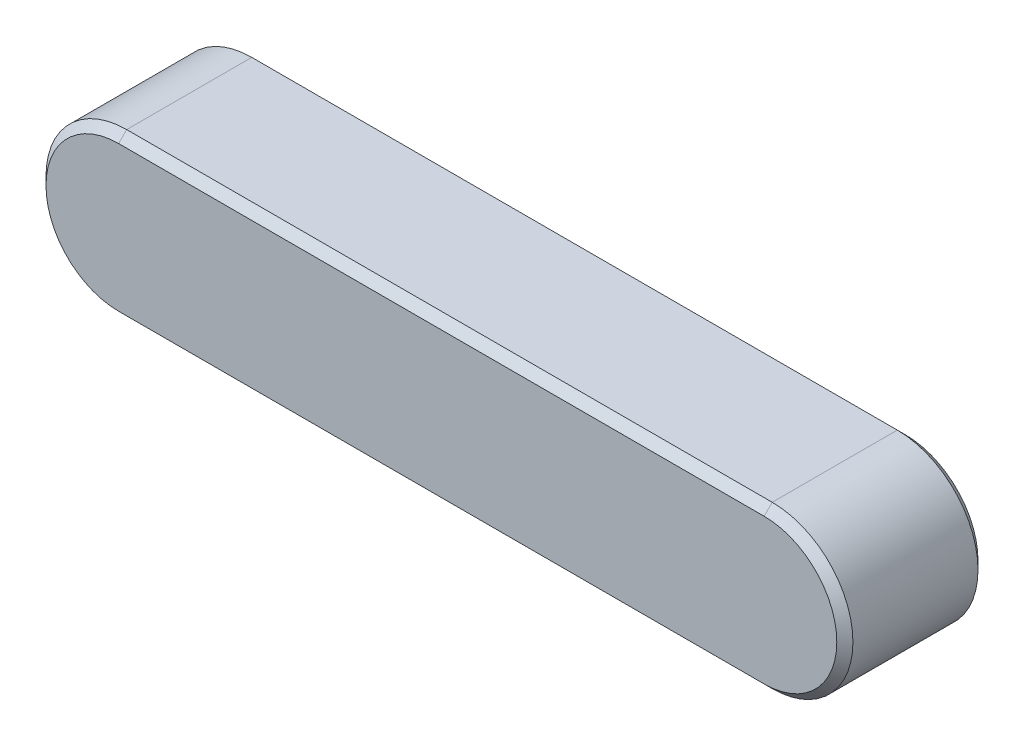
ISO-10303-21;
HEADER;
FILE_DESCRIPTION(('STEP AP214'),'2;1');
FILE_NAME('part.step','',(''),(''),'','','');
FILE_SCHEMA(('AUTOMOTIVE_DESIGN { 1 0 10303 214 1 1 1 1 }'));
ENDSEC;
DATA;
#1=APPLICATION_CONTEXT('core data for automotive mechanical design processes');
#2=APPLICATION_PROTOCOL_DEFINITION('international standard','automotive_design',2000,#1);
#3=PRODUCT_CONTEXT('',#1,'mechanical');
#4=PRODUCT('Part','Part','',(#3));
#5=PRODUCT_RELATED_PRODUCT_CATEGORY('part','',(#4));
#6=PRODUCT_DEFINITION_FORMATION('','',#4);
#7=PRODUCT_DEFINITION_CONTEXT('part definition',#1,'design');
#8=PRODUCT_DEFINITION('design','',#6,#7);
#9=PRODUCT_DEFINITION_SHAPE('','',#8);
#10=(LENGTH_UNIT() NAMED_UNIT(*) SI_UNIT(.MILLI.,.METRE.));
#11=(NAMED_UNIT(*) PLANE_ANGLE_UNIT() SI_UNIT($,.RADIAN.));
#12=(NAMED_UNIT(*) SI_UNIT($,.STERADIAN.) SOLID_ANGLE_UNIT());
#13=UNCERTAINTY_MEASURE_WITH_UNIT(LENGTH_MEASURE(1.E-05),#10,'distance_accuracy_value','');
#14=(GEOMETRIC_REPRESENTATION_CONTEXT(3) GLOBAL_UNCERTAINTY_ASSIGNED_CONTEXT((#13)) GLOBAL_UNIT_ASSIGNED_CONTEXT((#10,
#11,#12)) REPRESENTATION_CONTEXT('',''));
#15=CARTESIAN_POINT('',(0.,0.,0.));
#16=DIRECTION('',(0.,0.,1.));
#17=DIRECTION('',(1.,0.,0.));
#18=AXIS2_PLACEMENT_3D('',#15,#16,#17);
#19=CARTESIAN_POINT('',(-32.,0.,3.5));
#20=DIRECTION('',(0.,0.,-1.));
#21=DIRECTION('',(-1.,0.,0.));
#22=AXIS2_PLACEMENT_3D('',#19,#20,#21);
#23=CYLINDRICAL_SURFACE('',#22,4.);
#24=DIRECTION('',(0.,0.,-1.));
#25=VECTOR('',#24,1.);
#26=CARTESIAN_POINT('',(-32.,-4.,3.5));
#27=LINE('',#26,#25);
#28=CARTESIAN_POINT('',(-32.,-4.,3.1));
#29=VERTEX_POINT('',#28);
#30=CARTESIAN_POINT('',(-32.,-4.,-3.1));
#31=VERTEX_POINT('',#30);
#32=EDGE_CURVE('E122',#29,#31,#27,.T.);
#33=ORIENTED_EDGE('',*,*,#32,.F.);
#34=CARTESIAN_POINT('',(-32.,0.,3.1));
#35=DIRECTION('',(0.,0.,-1.));
#36=DIRECTION('',(-1.,0.,0.));
#37=AXIS2_PLACEMENT_3D('',#34,#35,#36);
#38=CIRCLE('',#37,4.);
#39=CARTESIAN_POINT('',(-32.,4.,3.1));
#40=VERTEX_POINT('',#39);
#41=EDGE_CURVE('E56',#29,#40,#38,.T.);
#42=ORIENTED_EDGE('',*,*,#41,.T.);
#43=DIRECTION('',(0.,0.,-1.));
#44=VECTOR('',#43,1.);
#45=CARTESIAN_POINT('',(-32.,4.,3.5));
#46=LINE('',#45,#44);
#47=CARTESIAN_POINT('',(-32.,4.,-3.1));
#48=VERTEX_POINT('',#47);
#49=EDGE_CURVE('E160',#40,#48,#46,.T.);
#50=ORIENTED_EDGE('',*,*,#49,.T.);
#51=CARTESIAN_POINT('',(-32.,0.,-3.1));
#52=DIRECTION('',(0.,0.,-1.));
#53=DIRECTION('',(-1.,0.,0.));
#54=AXIS2_PLACEMENT_3D('',#51,#52,#53);
#55=CIRCLE('',#54,4.);
#56=EDGE_CURVE('E110',#48,#31,#55,.F.);
#57=ORIENTED_EDGE('',*,*,#56,.T.);
#58=EDGE_LOOP('',(#33,#42,#50,#57));
#59=FACE_BOUND('',#58,.T.);
#60=ADVANCED_FACE('F33',(#59),#23,.T.);
#61=CARTESIAN_POINT('',(0.,-4.,3.5));
#62=DIRECTION('',(0.,1.,0.));
#63=DIRECTION('',(-1.,0.,0.));
#64=AXIS2_PLACEMENT_3D('',#61,#62,#63);
#65=PLANE('',#64);
#66=ORIENTED_EDGE('',*,*,#32,.T.);
#67=DIRECTION('',(1.,0.,0.));
#68=VECTOR('',#67,1.);
#69=CARTESIAN_POINT('',(0.,-4.,-3.1));
#70=LINE('',#69,#68);
#71=CARTESIAN_POINT('',(0.,-4.,-3.1));
#72=VERTEX_POINT('',#71);
#73=EDGE_CURVE('E121',#31,#72,#70,.T.);
#74=ORIENTED_EDGE('',*,*,#73,.T.);
#75=DIRECTION('',(0.,0.,-1.));
#76=VECTOR('',#75,1.);
#77=CARTESIAN_POINT('',(0.,-4.,3.5));
#78=LINE('',#77,#76);
#79=CARTESIAN_POINT('',(0.,-4.,3.1));
#80=VERTEX_POINT('',#79);
#81=EDGE_CURVE('E104',#80,#72,#78,.T.);
#82=ORIENTED_EDGE('',*,*,#81,.F.);
#83=DIRECTION('',(-1.,0.,0.));
#84=VECTOR('',#83,1.);
#85=CARTESIAN_POINT('',(0.,-4.,3.1));
#86=LINE('',#85,#84);
#87=EDGE_CURVE('E119',#80,#29,#86,.T.);
#88=ORIENTED_EDGE('',*,*,#87,.T.);
#89=EDGE_LOOP('',(#66,#74,#82,#88));
#90=FACE_BOUND('',#89,.T.);
#91=ADVANCED_FACE('F118',(#90),#65,.F.);
#92=CARTESIAN_POINT('',(0.,0.,3.5));
#93=DIRECTION('',(0.,0.,-1.));
#94=DIRECTION('',(-1.,0.,0.));
#95=AXIS2_PLACEMENT_3D('',#92,#93,#94);
#96=CYLINDRICAL_SURFACE('',#95,4.);
#97=DIRECTION('',(0.,0.,-1.));
#98=VECTOR('',#97,1.);
#99=CARTESIAN_POINT('',(0.,4.,3.5));
#100=LINE('',#99,#98);
#101=CARTESIAN_POINT('',(0.,4.,3.1));
#102=VERTEX_POINT('',#101);
#103=CARTESIAN_POINT('',(0.,4.,-3.1));
#104=VERTEX_POINT('',#103);
#105=EDGE_CURVE('E105',#102,#104,#100,.T.);
#106=ORIENTED_EDGE('',*,*,#105,.F.);
#107=CARTESIAN_POINT('',(0.,0.,3.1));
#108=DIRECTION('',(0.,0.,-1.));
#109=DIRECTION('',(-1.,0.,0.));
#110=AXIS2_PLACEMENT_3D('',#107,#108,#109);
#111=CIRCLE('',#110,4.);
#112=EDGE_CURVE('E101',#102,#80,#111,.T.);
#113=ORIENTED_EDGE('',*,*,#112,.T.);
#114=ORIENTED_EDGE('',*,*,#81,.T.);
#115=CARTESIAN_POINT('',(0.,0.,-3.1));
#116=DIRECTION('',(0.,0.,-1.));
#117=DIRECTION('',(-1.,0.,0.));
#118=AXIS2_PLACEMENT_3D('',#115,#116,#117);
#119=CIRCLE('',#118,4.);
#120=EDGE_CURVE('E111',#72,#104,#119,.F.);
#121=ORIENTED_EDGE('',*,*,#120,.T.);
#122=EDGE_LOOP('',(#106,#113,#114,#121));
#123=FACE_BOUND('',#122,.T.);
#124=ADVANCED_FACE('F103',(#123),#96,.T.);
#125=CARTESIAN_POINT('',(-32.,4.,3.5));
#126=DIRECTION('',(0.,-1.,0.));
#127=DIRECTION('',(0.,0.,-1.));
#128=AXIS2_PLACEMENT_3D('',#125,#126,#127);
#129=PLANE('',#128);
#130=ORIENTED_EDGE('',*,*,#49,.F.);
#131=DIRECTION('',(1.,0.,0.));
#132=VECTOR('',#131,1.);
#133=CARTESIAN_POINT('',(-32.,4.,3.1));
#134=LINE('',#133,#132);
#135=EDGE_CURVE('E11',#40,#102,#134,.T.);
#136=ORIENTED_EDGE('',*,*,#135,.T.);
#137=ORIENTED_EDGE('',*,*,#105,.T.);
#138=DIRECTION('',(-1.,0.,0.));
#139=VECTOR('',#138,1.);
#140=CARTESIAN_POINT('',(-32.,4.,-3.1));
#141=LINE('',#140,#139);
#142=EDGE_CURVE('E42',#104,#48,#141,.T.);
#143=ORIENTED_EDGE('',*,*,#142,.T.);
#144=EDGE_LOOP('',(#130,#136,#137,#143));
#145=FACE_BOUND('',#144,.T.);
#146=ADVANCED_FACE('F210',(#145),#129,.F.);
#147=CARTESIAN_POINT('',(-32.,0.,3.5));
#148=DIRECTION('',(0.,0.,-1.));
#149=DIRECTION('',(-1.,0.,0.));
#150=AXIS2_PLACEMENT_3D('',#147,#148,#149);
#151=PLANE('',#150);
#152=CARTESIAN_POINT('',(-32.,0.,3.5));
#153=DIRECTION('',(0.,0.,-1.));
#154=DIRECTION('',(-1.,0.,0.));
#155=AXIS2_PLACEMENT_3D('',#152,#153,#154);
#156=CIRCLE('',#155,3.6);
#157=CARTESIAN_POINT('',(-32.,3.6,3.5));
#158=VERTEX_POINT('',#157);
#159=CARTESIAN_POINT('',(-32.,-3.6,3.5));
#160=VERTEX_POINT('',#159);
#161=EDGE_CURVE('E181',#158,#160,#156,.F.);
#162=ORIENTED_EDGE('',*,*,#161,.T.);
#163=DIRECTION('',(1.,0.,0.));
#164=VECTOR('',#163,1.);
#165=CARTESIAN_POINT('',(-32.,-3.6,3.5));
#166=LINE('',#165,#164);
#167=CARTESIAN_POINT('',(0.,-3.6,3.5));
#168=VERTEX_POINT('',#167);
#169=EDGE_CURVE('E184',#160,#168,#166,.T.);
#170=ORIENTED_EDGE('',*,*,#169,.T.);
#171=CARTESIAN_POINT('',(0.,0.,3.5));
#172=DIRECTION('',(0.,0.,-1.));
#173=DIRECTION('',(-1.,0.,0.));
#174=AXIS2_PLACEMENT_3D('',#171,#172,#173);
#175=CIRCLE('',#174,3.6);
#176=CARTESIAN_POINT('',(0.,3.6,3.5));
#177=VERTEX_POINT('',#176);
#178=EDGE_CURVE('E133',#168,#177,#175,.F.);
#179=ORIENTED_EDGE('',*,*,#178,.T.);
#180=DIRECTION('',(-1.,0.,0.));
#181=VECTOR('',#180,1.);
#182=CARTESIAN_POINT('',(-32.,3.6,3.5));
#183=LINE('',#182,#181);
#184=EDGE_CURVE('E179',#177,#158,#183,.T.);
#185=ORIENTED_EDGE('',*,*,#184,.T.);
#186=EDGE_LOOP('',(#162,#170,#179,#185));
#187=FACE_BOUND('',#186,.T.);
#188=ADVANCED_FACE('F213',(#187),#151,.F.);
#189=CARTESIAN_POINT('',(-32.,0.,-3.5));
#190=DIRECTION('',(0.,0.,-1.));
#191=DIRECTION('',(-1.,0.,0.));
#192=AXIS2_PLACEMENT_3D('',#189,#190,#191);
#193=PLANE('',#192);
#194=CARTESIAN_POINT('',(0.,0.,-3.5));
#195=DIRECTION('',(0.,0.,-1.));
#196=DIRECTION('',(-1.,0.,0.));
#197=AXIS2_PLACEMENT_3D('',#194,#195,#196);
#198=CIRCLE('',#197,3.59999999999999);
#199=CARTESIAN_POINT('',(0.,3.59999999999999,-3.5));
#200=VERTEX_POINT('',#199);
#201=CARTESIAN_POINT('',(0.,-3.59999999999999,-3.5));
#202=VERTEX_POINT('',#201);
#203=EDGE_CURVE('E174',#200,#202,#198,.T.);
#204=ORIENTED_EDGE('',*,*,#203,.T.);
#205=DIRECTION('',(-1.,0.,0.));
#206=VECTOR('',#205,1.);
#207=CARTESIAN_POINT('',(-32.,-3.6,-3.5));
#208=LINE('',#207,#206);
#209=CARTESIAN_POINT('',(-32.,-3.59999999999999,-3.5));
#210=VERTEX_POINT('',#209);
#211=EDGE_CURVE('E176',#202,#210,#208,.T.);
#212=ORIENTED_EDGE('',*,*,#211,.T.);
#213=CARTESIAN_POINT('',(-32.,0.,-3.5));
#214=DIRECTION('',(0.,0.,-1.));
#215=DIRECTION('',(-1.,0.,0.));
#216=AXIS2_PLACEMENT_3D('',#213,#214,#215);
#217=CIRCLE('',#216,3.59999999999999);
#218=CARTESIAN_POINT('',(-32.,3.59999999999999,-3.5));
#219=VERTEX_POINT('',#218);
#220=EDGE_CURVE('E172',#210,#219,#217,.T.);
#221=ORIENTED_EDGE('',*,*,#220,.T.);
#222=DIRECTION('',(1.,0.,0.));
#223=VECTOR('',#222,1.);
#224=CARTESIAN_POINT('',(0.,3.59999999999999,-3.5));
#225=LINE('',#224,#223);
#226=EDGE_CURVE('E170',#219,#200,#225,.T.);
#227=ORIENTED_EDGE('',*,*,#226,.T.);
#228=EDGE_LOOP('',(#204,#212,#221,#227));
#229=FACE_BOUND('',#228,.T.);
#230=ADVANCED_FACE('F214',(#229),#193,.T.);
#231=CARTESIAN_POINT('',(-32.,4.,-3.1));
#232=DIRECTION('',(0.,0.707106781186544,-0.707106781186551));
#233=DIRECTION('',(0.,0.707106781186551,0.707106781186544));
#234=AXIS2_PLACEMENT_3D('',#231,#232,#233);
#235=PLANE('',#234);
#236=DIRECTION('',(0.,0.707106781186551,0.707106781186544));
#237=VECTOR('',#236,1.);
#238=CARTESIAN_POINT('',(0.,3.59999999999999,-3.5));
#239=LINE('',#238,#237);
#240=EDGE_CURVE('E152',#200,#104,#239,.T.);
#241=ORIENTED_EDGE('',*,*,#240,.F.);
#242=ORIENTED_EDGE('',*,*,#226,.F.);
#243=DIRECTION('',(0.,-0.707106781186551,-0.707106781186544));
#244=VECTOR('',#243,1.);
#245=CARTESIAN_POINT('',(-32.,4.,-3.1));
#246=LINE('',#245,#244);
#247=EDGE_CURVE('E139',#48,#219,#246,.T.);
#248=ORIENTED_EDGE('',*,*,#247,.F.);
#249=ORIENTED_EDGE('',*,*,#142,.F.);
#250=EDGE_LOOP('',(#241,#242,#248,#249));
#251=FACE_BOUND('',#250,.T.);
#252=ADVANCED_FACE('F217',(#251),#235,.T.);
#253=CARTESIAN_POINT('',(-32.,0.,-3.1));
#254=DIRECTION('',(0.,0.,1.));
#255=DIRECTION('',(1.,0.,0.));
#256=AXIS2_PLACEMENT_3D('',#253,#254,#255);
#257=CONICAL_SURFACE('',#256,4.,0.785398163397453);
#258=ORIENTED_EDGE('',*,*,#247,.T.);
#259=ORIENTED_EDGE('',*,*,#220,.F.);
#260=DIRECTION('',(0.,0.707106781186551,-0.707106781186544));
#261=VECTOR('',#260,1.);
#262=CARTESIAN_POINT('',(-32.,-4.,-3.1));
#263=LINE('',#262,#261);
#264=EDGE_CURVE('E146',#31,#210,#263,.T.);
#265=ORIENTED_EDGE('',*,*,#264,.F.);
#266=ORIENTED_EDGE('',*,*,#56,.F.);
#267=EDGE_LOOP('',(#258,#259,#265,#266));
#268=FACE_BOUND('',#267,.T.);
#269=ADVANCED_FACE('F189',(#268),#257,.T.);
#270=CARTESIAN_POINT('',(0.,0.,-3.1));
#271=DIRECTION('',(0.,0.,1.));
#272=DIRECTION('',(1.,0.,0.));
#273=AXIS2_PLACEMENT_3D('',#270,#271,#272);
#274=CONICAL_SURFACE('',#273,4.,0.785398163397453);
#275=ORIENTED_EDGE('',*,*,#240,.T.);
#276=ORIENTED_EDGE('',*,*,#120,.F.);
#277=DIRECTION('',(0.,-0.707106781186551,0.707106781186544));
#278=VECTOR('',#277,1.);
#279=CARTESIAN_POINT('',(0.,-3.59999999999999,-3.5));
#280=LINE('',#279,#278);
#281=EDGE_CURVE('E142',#202,#72,#280,.T.);
#282=ORIENTED_EDGE('',*,*,#281,.F.);
#283=ORIENTED_EDGE('',*,*,#203,.F.);
#284=EDGE_LOOP('',(#275,#276,#282,#283));
#285=FACE_BOUND('',#284,.T.);
#286=ADVANCED_FACE('F192',(#285),#274,.T.);
#287=CARTESIAN_POINT('',(0.,-4.,-3.1));
#288=DIRECTION('',(0.,-0.707106781186544,-0.707106781186551));
#289=DIRECTION('',(0.,0.707106781186551,-0.707106781186544));
#290=AXIS2_PLACEMENT_3D('',#287,#288,#289);
#291=PLANE('',#290);
#292=ORIENTED_EDGE('',*,*,#264,.T.);
#293=ORIENTED_EDGE('',*,*,#211,.F.);
#294=ORIENTED_EDGE('',*,*,#281,.T.);
#295=ORIENTED_EDGE('',*,*,#73,.F.);
#296=EDGE_LOOP('',(#292,#293,#294,#295));
#297=FACE_BOUND('',#296,.T.);
#298=ADVANCED_FACE('F190',(#297),#291,.T.);
#299=CARTESIAN_POINT('',(-32.,3.6,3.5));
#300=DIRECTION('',(0.,-0.707106781186547,-0.707106781186547));
#301=DIRECTION('',(0.,0.707106781186548,-0.707106781186548));
#302=AXIS2_PLACEMENT_3D('',#299,#300,#301);
#303=PLANE('',#302);
#304=DIRECTION('',(0.,-0.707106781186547,0.707106781186547));
#305=VECTOR('',#304,1.);
#306=CARTESIAN_POINT('',(0.,4.,3.1));
#307=LINE('',#306,#305);
#308=EDGE_CURVE('E136',#102,#177,#307,.T.);
#309=ORIENTED_EDGE('',*,*,#308,.F.);
#310=ORIENTED_EDGE('',*,*,#135,.F.);
#311=DIRECTION('',(0.,0.707106781186547,-0.707106781186547));
#312=VECTOR('',#311,1.);
#313=CARTESIAN_POINT('',(-32.,3.6,3.5));
#314=LINE('',#313,#312);
#315=EDGE_CURVE('E37',#158,#40,#314,.T.);
#316=ORIENTED_EDGE('',*,*,#315,.F.);
#317=ORIENTED_EDGE('',*,*,#184,.F.);
#318=EDGE_LOOP('',(#309,#310,#316,#317));
#319=FACE_BOUND('',#318,.T.);
#320=ADVANCED_FACE('F35',(#319),#303,.F.);
#321=CARTESIAN_POINT('',(-32.,0.,3.5));
#322=DIRECTION('',(0.,0.,-1.));
#323=DIRECTION('',(-1.,0.,0.));
#324=AXIS2_PLACEMENT_3D('',#321,#322,#323);
#325=CONICAL_SURFACE('',#324,3.6,0.785398163397448);
#326=ORIENTED_EDGE('',*,*,#315,.T.);
#327=ORIENTED_EDGE('',*,*,#41,.F.);
#328=DIRECTION('',(0.,-0.707106781186547,-0.707106781186547));
#329=VECTOR('',#328,1.);
#330=CARTESIAN_POINT('',(-32.,-3.6,3.5));
#331=LINE('',#330,#329);
#332=EDGE_CURVE('E130',#160,#29,#331,.T.);
#333=ORIENTED_EDGE('',*,*,#332,.F.);
#334=ORIENTED_EDGE('',*,*,#161,.F.);
#335=EDGE_LOOP('',(#326,#327,#333,#334));
#336=FACE_BOUND('',#335,.T.);
#337=ADVANCED_FACE('F198',(#336),#325,.T.);
#338=CARTESIAN_POINT('',(0.,0.,3.5));
#339=DIRECTION('',(0.,0.,-1.));
#340=DIRECTION('',(-1.,0.,0.));
#341=AXIS2_PLACEMENT_3D('',#338,#339,#340);
#342=CONICAL_SURFACE('',#341,3.6,0.785398163397448);
#343=ORIENTED_EDGE('',*,*,#308,.T.);
#344=ORIENTED_EDGE('',*,*,#178,.F.);
#345=DIRECTION('',(0.,0.707106781186547,0.707106781186547));
#346=VECTOR('',#345,1.);
#347=CARTESIAN_POINT('',(0.,-4.,3.1));
#348=LINE('',#347,#346);
#349=EDGE_CURVE('E127',#80,#168,#348,.T.);
#350=ORIENTED_EDGE('',*,*,#349,.F.);
#351=ORIENTED_EDGE('',*,*,#112,.F.);
#352=EDGE_LOOP('',(#343,#344,#350,#351));
#353=FACE_BOUND('',#352,.T.);
#354=ADVANCED_FACE('F132',(#353),#342,.T.);
#355=CARTESIAN_POINT('',(-32.,-3.6,3.5));
#356=DIRECTION('',(0.,0.707106781186547,-0.707106781186547));
#357=DIRECTION('',(0.,0.707106781186548,0.707106781186548));
#358=AXIS2_PLACEMENT_3D('',#355,#356,#357);
#359=PLANE('',#358);
#360=ORIENTED_EDGE('',*,*,#332,.T.);
#361=ORIENTED_EDGE('',*,*,#87,.F.);
#362=ORIENTED_EDGE('',*,*,#349,.T.);
#363=ORIENTED_EDGE('',*,*,#169,.F.);
#364=EDGE_LOOP('',(#360,#361,#362,#363));
#365=FACE_BOUND('',#364,.T.);
#366=ADVANCED_FACE('F125',(#365),#359,.F.);
#367=CLOSED_SHELL('',(#60,#91,#124,#146,#188,#230,#252,#269,#286,#298,#320,#337,#354,#366));
#368=MANIFOLD_SOLID_BREP('B2',#367);
#369=ADVANCED_BREP_SHAPE_REPRESENTATION('',(#18,#368),#14);
#370=SHAPE_DEFINITION_REPRESENTATION(#9,#369);
ENDSEC;
END-ISO-10303-21;
